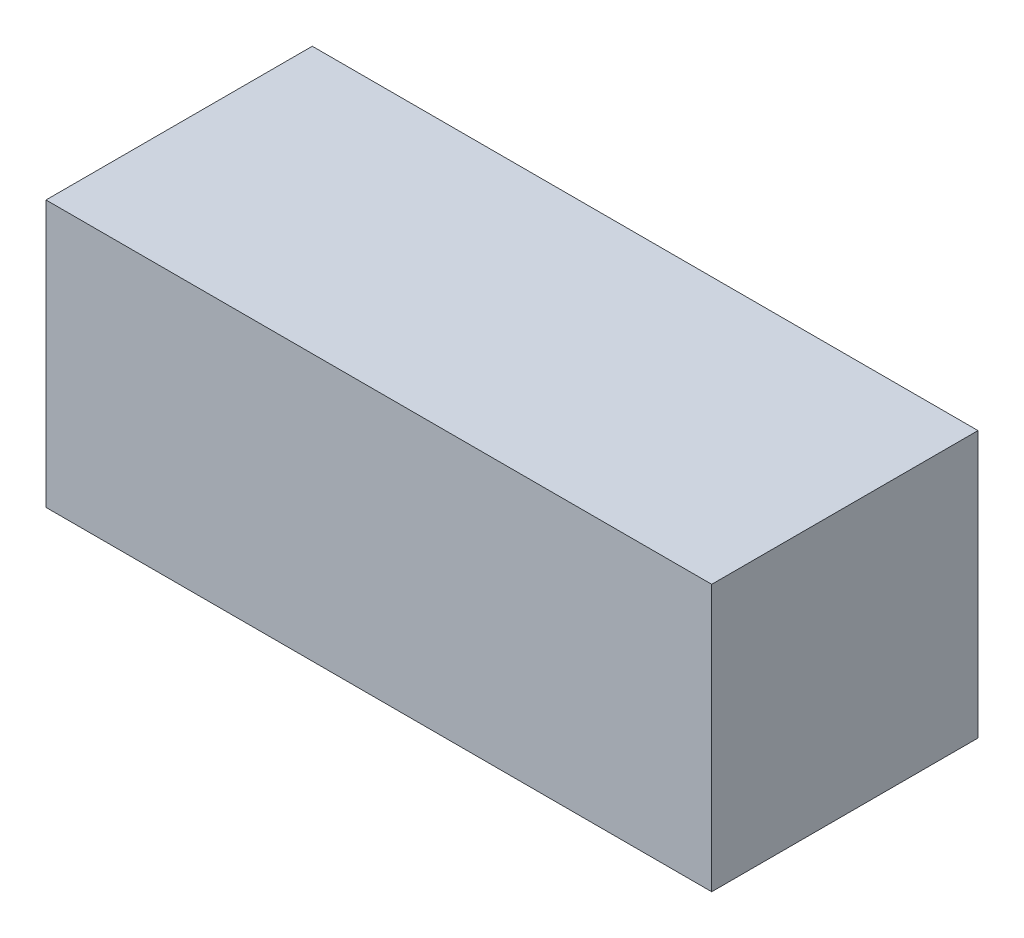
ISO-10303-21;
HEADER;
FILE_DESCRIPTION(('STEP AP214'),'2;1');
FILE_NAME('part.step','',(''),(''),'','','');
FILE_SCHEMA(('AUTOMOTIVE_DESIGN { 1 0 10303 214 1 1 1 1 }'));
ENDSEC;
DATA;
#1=APPLICATION_CONTEXT('core data for automotive mechanical design processes');
#2=APPLICATION_PROTOCOL_DEFINITION('international standard','automotive_design',2000,#1);
#3=PRODUCT_CONTEXT('',#1,'mechanical');
#4=PRODUCT('Part','Part','',(#3));
#5=PRODUCT_RELATED_PRODUCT_CATEGORY('part','',(#4));
#6=PRODUCT_DEFINITION_FORMATION('','',#4);
#7=PRODUCT_DEFINITION_CONTEXT('part definition',#1,'design');
#8=PRODUCT_DEFINITION('design','',#6,#7);
#9=PRODUCT_DEFINITION_SHAPE('','',#8);
#10=(LENGTH_UNIT() NAMED_UNIT(*) SI_UNIT(.MILLI.,.METRE.));
#11=(NAMED_UNIT(*) PLANE_ANGLE_UNIT() SI_UNIT($,.RADIAN.));
#12=(NAMED_UNIT(*) SI_UNIT($,.STERADIAN.) SOLID_ANGLE_UNIT());
#13=UNCERTAINTY_MEASURE_WITH_UNIT(LENGTH_MEASURE(1.E-05),#10,'distance_accuracy_value','');
#14=(GEOMETRIC_REPRESENTATION_CONTEXT(3) GLOBAL_UNCERTAINTY_ASSIGNED_CONTEXT((#13)) GLOBAL_UNIT_ASSIGNED_CONTEXT((#10,
#11,#12)) REPRESENTATION_CONTEXT('',''));
#15=CARTESIAN_POINT('',(0.,0.,0.));
#16=DIRECTION('',(0.,0.,1.));
#17=DIRECTION('',(1.,0.,0.));
#18=AXIS2_PLACEMENT_3D('',#15,#16,#17);
#19=CARTESIAN_POINT('',(250.,55.0357586070998,39.2950391644909));
#20=DIRECTION('',(0.,0.,-1.));
#21=DIRECTION('',(0.,1.,0.));
#22=AXIS2_PLACEMENT_3D('',#19,#20,#21);
#23=PLANE('',#22);
#24=DIRECTION('',(0.,-1.,0.));
#25=VECTOR('',#24,1.);
#26=CARTESIAN_POINT('',(0.,55.0357586070998,39.2950391644909));
#27=LINE('',#26,#25);
#28=CARTESIAN_POINT('',(0.,55.0357586070998,39.2950391644909));
#29=VERTEX_POINT('',#28);
#30=CARTESIAN_POINT('',(0.,-44.9642413929002,39.2950391644909));
#31=VERTEX_POINT('',#30);
#32=EDGE_CURVE('E98',#29,#31,#27,.T.);
#33=ORIENTED_EDGE('',*,*,#32,.T.);
#34=DIRECTION('',(-1.,0.,0.));
#35=VECTOR('',#34,1.);
#36=CARTESIAN_POINT('',(250.,-44.9642413929002,39.2950391644909));
#37=LINE('',#36,#35);
#38=CARTESIAN_POINT('',(250.,-44.9642413929002,39.2950391644909));
#39=VERTEX_POINT('',#38);
#40=EDGE_CURVE('E11',#39,#31,#37,.T.);
#41=ORIENTED_EDGE('',*,*,#40,.F.);
#42=DIRECTION('',(0.,-1.,0.));
#43=VECTOR('',#42,1.);
#44=CARTESIAN_POINT('',(250.,55.0357586070998,39.2950391644909));
#45=LINE('',#44,#43);
#46=CARTESIAN_POINT('',(250.,55.0357586070998,39.2950391644909));
#47=VERTEX_POINT('',#46);
#48=EDGE_CURVE('E86',#47,#39,#45,.T.);
#49=ORIENTED_EDGE('',*,*,#48,.F.);
#50=DIRECTION('',(-1.,0.,0.));
#51=VECTOR('',#50,1.);
#52=CARTESIAN_POINT('',(250.,55.0357586070998,39.2950391644909));
#53=LINE('',#52,#51);
#54=EDGE_CURVE('E94',#47,#29,#53,.T.);
#55=ORIENTED_EDGE('',*,*,#54,.T.);
#56=EDGE_LOOP('',(#33,#41,#49,#55));
#57=FACE_BOUND('',#56,.T.);
#58=ADVANCED_FACE('F35',(#57),#23,.F.);
#59=CARTESIAN_POINT('',(250.,-44.9642413929002,39.2950391644909));
#60=DIRECTION('',(0.,1.,0.));
#61=DIRECTION('',(0.,0.,1.));
#62=AXIS2_PLACEMENT_3D('',#59,#60,#61);
#63=PLANE('',#62);
#64=DIRECTION('',(0.,0.,-1.));
#65=VECTOR('',#64,1.);
#66=CARTESIAN_POINT('',(0.,-44.9642413929002,39.2950391644909));
#67=LINE('',#66,#65);
#68=CARTESIAN_POINT('',(0.,-44.9642413929002,-60.7049608355091));
#69=VERTEX_POINT('',#68);
#70=EDGE_CURVE('E90',#31,#69,#67,.T.);
#71=ORIENTED_EDGE('',*,*,#70,.T.);
#72=DIRECTION('',(-1.,0.,0.));
#73=VECTOR('',#72,1.);
#74=CARTESIAN_POINT('',(250.,-44.9642413929002,-60.7049608355091));
#75=LINE('',#74,#73);
#76=CARTESIAN_POINT('',(250.,-44.9642413929002,-60.7049608355091));
#77=VERTEX_POINT('',#76);
#78=EDGE_CURVE('E43',#77,#69,#75,.T.);
#79=ORIENTED_EDGE('',*,*,#78,.F.);
#80=DIRECTION('',(0.,0.,-1.));
#81=VECTOR('',#80,1.);
#82=CARTESIAN_POINT('',(250.,-44.9642413929002,39.2950391644909));
#83=LINE('',#82,#81);
#84=EDGE_CURVE('E81',#39,#77,#83,.T.);
#85=ORIENTED_EDGE('',*,*,#84,.F.);
#86=ORIENTED_EDGE('',*,*,#40,.T.);
#87=EDGE_LOOP('',(#71,#79,#85,#86));
#88=FACE_BOUND('',#87,.T.);
#89=ADVANCED_FACE('F89',(#88),#63,.F.);
#90=CARTESIAN_POINT('',(250.,55.0357586070998,-60.7049608355091));
#91=DIRECTION('',(0.,0.,1.));
#92=DIRECTION('',(0.,-1.,0.));
#93=AXIS2_PLACEMENT_3D('',#90,#91,#92);
#94=PLANE('',#93);
#95=DIRECTION('',(0.,1.,0.));
#96=VECTOR('',#95,1.);
#97=CARTESIAN_POINT('',(0.,55.0357586070998,-60.7049608355091));
#98=LINE('',#97,#96);
#99=CARTESIAN_POINT('',(0.,55.0357586070998,-60.7049608355091));
#100=VERTEX_POINT('',#99);
#101=EDGE_CURVE('E68',#69,#100,#98,.T.);
#102=ORIENTED_EDGE('',*,*,#101,.T.);
#103=DIRECTION('',(-1.,0.,0.));
#104=VECTOR('',#103,1.);
#105=CARTESIAN_POINT('',(250.,55.0357586070998,-60.7049608355091));
#106=LINE('',#105,#104);
#107=CARTESIAN_POINT('',(250.,55.0357586070998,-60.7049608355091));
#108=VERTEX_POINT('',#107);
#109=EDGE_CURVE('E91',#108,#100,#106,.T.);
#110=ORIENTED_EDGE('',*,*,#109,.F.);
#111=DIRECTION('',(0.,1.,0.));
#112=VECTOR('',#111,1.);
#113=CARTESIAN_POINT('',(250.,55.0357586070998,-60.7049608355091));
#114=LINE('',#113,#112);
#115=EDGE_CURVE('E84',#77,#108,#114,.T.);
#116=ORIENTED_EDGE('',*,*,#115,.F.);
#117=ORIENTED_EDGE('',*,*,#78,.T.);
#118=EDGE_LOOP('',(#102,#110,#116,#117));
#119=FACE_BOUND('',#118,.T.);
#120=ADVANCED_FACE('F92',(#119),#94,.F.);
#121=CARTESIAN_POINT('',(250.,55.0357586070998,39.2950391644909));
#122=DIRECTION('',(0.,-1.,0.));
#123=DIRECTION('',(0.,0.,-1.));
#124=AXIS2_PLACEMENT_3D('',#121,#122,#123);
#125=PLANE('',#124);
#126=DIRECTION('',(0.,0.,1.));
#127=VECTOR('',#126,1.);
#128=CARTESIAN_POINT('',(0.,55.0357586070998,39.2950391644909));
#129=LINE('',#128,#127);
#130=EDGE_CURVE('E74',#100,#29,#129,.T.);
#131=ORIENTED_EDGE('',*,*,#130,.T.);
#132=ORIENTED_EDGE('',*,*,#54,.F.);
#133=DIRECTION('',(0.,0.,1.));
#134=VECTOR('',#133,1.);
#135=CARTESIAN_POINT('',(250.,55.0357586070998,39.2950391644909));
#136=LINE('',#135,#134);
#137=EDGE_CURVE('E51',#108,#47,#136,.T.);
#138=ORIENTED_EDGE('',*,*,#137,.F.);
#139=ORIENTED_EDGE('',*,*,#109,.T.);
#140=EDGE_LOOP('',(#131,#132,#138,#139));
#141=FACE_BOUND('',#140,.T.);
#142=ADVANCED_FACE('F105',(#141),#125,.F.);
#143=CARTESIAN_POINT('',(250.,0.,0.));
#144=DIRECTION('',(1.,0.,0.));
#145=DIRECTION('',(0.,0.,-1.));
#146=AXIS2_PLACEMENT_3D('',#143,#144,#145);
#147=PLANE('',#146);
#148=ORIENTED_EDGE('',*,*,#48,.T.);
#149=ORIENTED_EDGE('',*,*,#84,.T.);
#150=ORIENTED_EDGE('',*,*,#115,.T.);
#151=ORIENTED_EDGE('',*,*,#137,.T.);
#152=EDGE_LOOP('',(#148,#149,#150,#151));
#153=FACE_BOUND('',#152,.T.);
#154=ADVANCED_FACE('F82',(#153),#147,.T.);
#155=CARTESIAN_POINT('',(0.,0.,0.));
#156=DIRECTION('',(1.,0.,0.));
#157=DIRECTION('',(0.,0.,-1.));
#158=AXIS2_PLACEMENT_3D('',#155,#156,#157);
#159=PLANE('',#158);
#160=ORIENTED_EDGE('',*,*,#32,.F.);
#161=ORIENTED_EDGE('',*,*,#130,.F.);
#162=ORIENTED_EDGE('',*,*,#101,.F.);
#163=ORIENTED_EDGE('',*,*,#70,.F.);
#164=EDGE_LOOP('',(#160,#161,#162,#163));
#165=FACE_BOUND('',#164,.T.);
#166=ADVANCED_FACE('F108',(#165),#159,.F.);
#167=CLOSED_SHELL('',(#58,#89,#120,#142,#154,#166));
#168=MANIFOLD_SOLID_BREP('B2',#167);
#169=ADVANCED_BREP_SHAPE_REPRESENTATION('',(#18,#168),#14);
#170=SHAPE_DEFINITION_REPRESENTATION(#9,#169);
ENDSEC;
END-ISO-10303-21;
